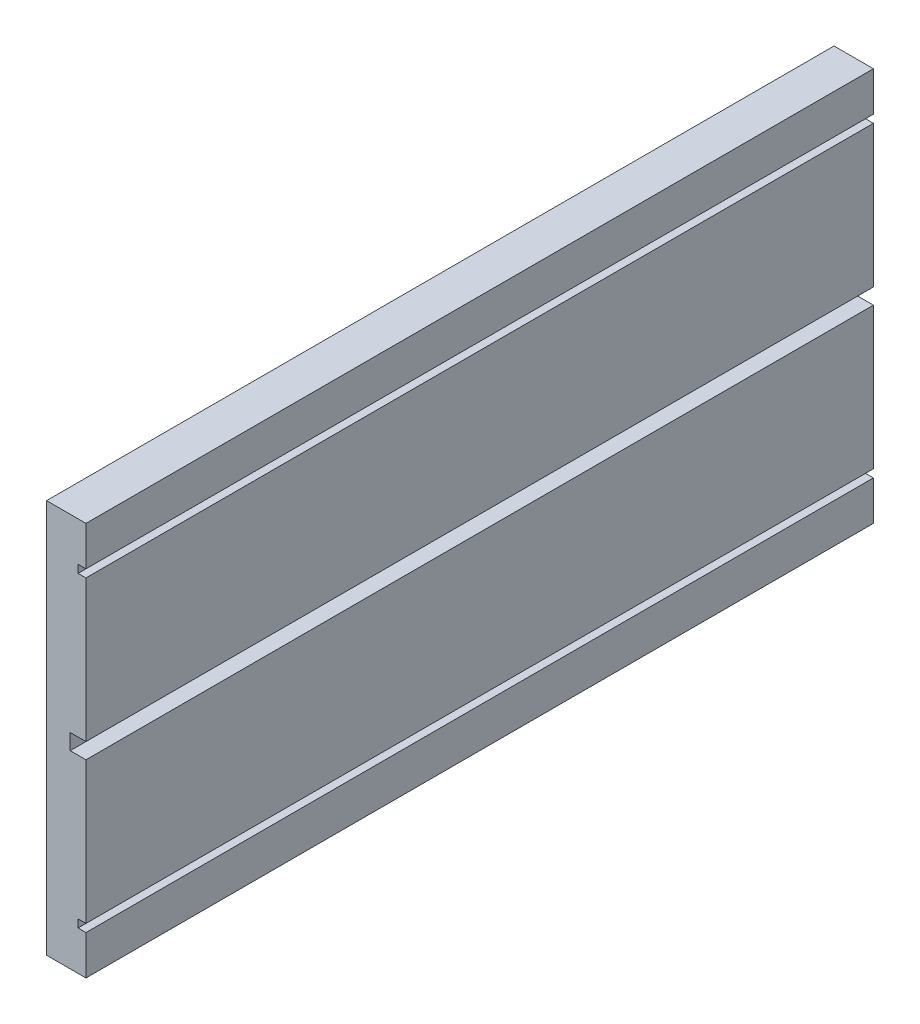
ISO-10303-21;
HEADER;
FILE_DESCRIPTION(('STEP AP214'),'2;1');
FILE_NAME('part.step','',(''),(''),'','','');
FILE_SCHEMA(('AUTOMOTIVE_DESIGN { 1 0 10303 214 1 1 1 1 }'));
ENDSEC;
DATA;
#1=APPLICATION_CONTEXT('core data for automotive mechanical design processes');
#2=APPLICATION_PROTOCOL_DEFINITION('international standard','automotive_design',2000,#1);
#3=PRODUCT_CONTEXT('',#1,'mechanical');
#4=PRODUCT('Part','Part','',(#3));
#5=PRODUCT_RELATED_PRODUCT_CATEGORY('part','',(#4));
#6=PRODUCT_DEFINITION_FORMATION('','',#4);
#7=PRODUCT_DEFINITION_CONTEXT('part definition',#1,'design');
#8=PRODUCT_DEFINITION('design','',#6,#7);
#9=PRODUCT_DEFINITION_SHAPE('','',#8);
#10=(LENGTH_UNIT() NAMED_UNIT(*) SI_UNIT(.MILLI.,.METRE.));
#11=(NAMED_UNIT(*) PLANE_ANGLE_UNIT() SI_UNIT($,.RADIAN.));
#12=(NAMED_UNIT(*) SI_UNIT($,.STERADIAN.) SOLID_ANGLE_UNIT());
#13=UNCERTAINTY_MEASURE_WITH_UNIT(LENGTH_MEASURE(1.E-05),#10,'distance_accuracy_value','');
#14=(GEOMETRIC_REPRESENTATION_CONTEXT(3) GLOBAL_UNCERTAINTY_ASSIGNED_CONTEXT((#13)) GLOBAL_UNIT_ASSIGNED_CONTEXT((#10,
#11,#12)) REPRESENTATION_CONTEXT('',''));
#15=CARTESIAN_POINT('',(0.,0.,0.));
#16=DIRECTION('',(0.,0.,1.));
#17=DIRECTION('',(1.,0.,0.));
#18=AXIS2_PLACEMENT_3D('',#15,#16,#17);
#19=CARTESIAN_POINT('',(0.025,0.25,1.));
#20=DIRECTION('',(-1.,0.,0.));
#21=DIRECTION('',(0.,-1.,0.));
#22=AXIS2_PLACEMENT_3D('',#19,#20,#21);
#23=PLANE('',#22);
#24=DIRECTION('',(0.,1.,0.));
#25=VECTOR('',#24,1.);
#26=CARTESIAN_POINT('',(0.025,0.25,1.));
#27=LINE('',#26,#25);
#28=CARTESIAN_POINT('',(0.025,0.0099999999999996,1.));
#29=VERTEX_POINT('',#28);
#30=CARTESIAN_POINT('',(0.025,0.19,1.));
#31=VERTEX_POINT('',#30);
#32=EDGE_CURVE('E230',#29,#31,#27,.T.);
#33=ORIENTED_EDGE('',*,*,#32,.F.);
#34=DIRECTION('',(0.,0.,1.));
#35=VECTOR('',#34,1.);
#36=CARTESIAN_POINT('',(0.025,0.0099999999999996,1.));
#37=LINE('',#36,#35);
#38=CARTESIAN_POINT('',(0.025,0.0099999999999996,0.));
#39=VERTEX_POINT('',#38);
#40=EDGE_CURVE('E164',#39,#29,#37,.T.);
#41=ORIENTED_EDGE('',*,*,#40,.F.);
#42=DIRECTION('',(0.,1.,0.));
#43=VECTOR('',#42,1.);
#44=CARTESIAN_POINT('',(0.025,0.25,0.));
#45=LINE('',#44,#43);
#46=CARTESIAN_POINT('',(0.025,0.19,0.));
#47=VERTEX_POINT('',#46);
#48=EDGE_CURVE('E242',#39,#47,#45,.T.);
#49=ORIENTED_EDGE('',*,*,#48,.T.);
#50=DIRECTION('',(0.,0.,-1.));
#51=VECTOR('',#50,1.);
#52=CARTESIAN_POINT('',(0.025,0.19,1.));
#53=LINE('',#52,#51);
#54=EDGE_CURVE('E187',#31,#47,#53,.T.);
#55=ORIENTED_EDGE('',*,*,#54,.F.);
#56=EDGE_LOOP('',(#33,#41,#49,#55));
#57=FACE_BOUND('',#56,.T.);
#58=ADVANCED_FACE('F36',(#57),#23,.F.);
#59=CARTESIAN_POINT('',(0.025,0.2,1.));
#60=VERTEX_POINT('',#59);
#61=CARTESIAN_POINT('',(0.025,0.25,1.));
#62=VERTEX_POINT('',#61);
#63=EDGE_CURVE('E248',#60,#62,#27,.T.);
#64=ORIENTED_EDGE('',*,*,#63,.F.);
#65=DIRECTION('',(0.,0.,1.));
#66=VECTOR('',#65,1.);
#67=CARTESIAN_POINT('',(0.025,0.2,1.));
#68=LINE('',#67,#66);
#69=CARTESIAN_POINT('',(0.025,0.2,0.));
#70=VERTEX_POINT('',#69);
#71=EDGE_CURVE('E179',#70,#60,#68,.T.);
#72=ORIENTED_EDGE('',*,*,#71,.F.);
#73=CARTESIAN_POINT('',(0.025,0.25,0.));
#74=VERTEX_POINT('',#73);
#75=EDGE_CURVE('E195',#70,#74,#45,.T.);
#76=ORIENTED_EDGE('',*,*,#75,.T.);
#77=DIRECTION('',(0.,0.,-1.));
#78=VECTOR('',#77,1.);
#79=CARTESIAN_POINT('',(0.025,0.25,1.));
#80=LINE('',#79,#78);
#81=EDGE_CURVE('E11',#62,#74,#80,.T.);
#82=ORIENTED_EDGE('',*,*,#81,.F.);
#83=EDGE_LOOP('',(#64,#72,#76,#82));
#84=FACE_BOUND('',#83,.T.);
#85=ADVANCED_FACE('F282',(#84),#23,.F.);
#86=CARTESIAN_POINT('',(0.025,-0.19,0.));
#87=VERTEX_POINT('',#86);
#88=CARTESIAN_POINT('',(0.025,-0.0100000000000002,0.));
#89=VERTEX_POINT('',#88);
#90=EDGE_CURVE('E241',#87,#89,#45,.T.);
#91=ORIENTED_EDGE('',*,*,#90,.T.);
#92=DIRECTION('',(0.,0.,-1.));
#93=VECTOR('',#92,1.);
#94=CARTESIAN_POINT('',(0.025,-0.0100000000000002,1.));
#95=LINE('',#94,#93);
#96=CARTESIAN_POINT('',(0.025,-0.0100000000000002,1.));
#97=VERTEX_POINT('',#96);
#98=EDGE_CURVE('E290',#97,#89,#95,.T.);
#99=ORIENTED_EDGE('',*,*,#98,.F.);
#100=CARTESIAN_POINT('',(0.025,-0.19,1.));
#101=VERTEX_POINT('',#100);
#102=EDGE_CURVE('E170',#101,#97,#27,.T.);
#103=ORIENTED_EDGE('',*,*,#102,.F.);
#104=DIRECTION('',(0.,0.,1.));
#105=VECTOR('',#104,1.);
#106=CARTESIAN_POINT('',(0.025,-0.19,1.));
#107=LINE('',#106,#105);
#108=EDGE_CURVE('E207',#87,#101,#107,.T.);
#109=ORIENTED_EDGE('',*,*,#108,.F.);
#110=EDGE_LOOP('',(#91,#99,#103,#109));
#111=FACE_BOUND('',#110,.T.);
#112=ADVANCED_FACE('F289',(#111),#23,.F.);
#113=CARTESIAN_POINT('',(0.025,-0.25,0.));
#114=VERTEX_POINT('',#113);
#115=CARTESIAN_POINT('',(0.025,-0.2,0.));
#116=VERTEX_POINT('',#115);
#117=EDGE_CURVE('E237',#114,#116,#45,.T.);
#118=ORIENTED_EDGE('',*,*,#117,.T.);
#119=DIRECTION('',(0.,0.,-1.));
#120=VECTOR('',#119,1.);
#121=CARTESIAN_POINT('',(0.025,-0.2,1.));
#122=LINE('',#121,#120);
#123=CARTESIAN_POINT('',(0.025,-0.2,1.));
#124=VERTEX_POINT('',#123);
#125=EDGE_CURVE('E215',#124,#116,#122,.T.);
#126=ORIENTED_EDGE('',*,*,#125,.F.);
#127=CARTESIAN_POINT('',(0.025,-0.25,1.));
#128=VERTEX_POINT('',#127);
#129=EDGE_CURVE('E226',#128,#124,#27,.T.);
#130=ORIENTED_EDGE('',*,*,#129,.F.);
#131=DIRECTION('',(0.,0.,-1.));
#132=VECTOR('',#131,1.);
#133=CARTESIAN_POINT('',(0.025,-0.25,1.));
#134=LINE('',#133,#132);
#135=EDGE_CURVE('E236',#128,#114,#134,.T.);
#136=ORIENTED_EDGE('',*,*,#135,.T.);
#137=EDGE_LOOP('',(#118,#126,#130,#136));
#138=FACE_BOUND('',#137,.T.);
#139=ADVANCED_FACE('F38',(#138),#23,.F.);
#140=CARTESIAN_POINT('',(-0.025,0.25,1.));
#141=DIRECTION('',(0.,-1.,0.));
#142=DIRECTION('',(0.,0.,-1.));
#143=AXIS2_PLACEMENT_3D('',#140,#141,#142);
#144=PLANE('',#143);
#145=DIRECTION('',(-1.,0.,0.));
#146=VECTOR('',#145,1.);
#147=CARTESIAN_POINT('',(-0.025,0.25,0.));
#148=LINE('',#147,#146);
#149=CARTESIAN_POINT('',(-0.025,0.25,0.));
#150=VERTEX_POINT('',#149);
#151=EDGE_CURVE('E240',#74,#150,#148,.T.);
#152=ORIENTED_EDGE('',*,*,#151,.T.);
#153=DIRECTION('',(0.,0.,-1.));
#154=VECTOR('',#153,1.);
#155=CARTESIAN_POINT('',(-0.025,0.25,1.));
#156=LINE('',#155,#154);
#157=CARTESIAN_POINT('',(-0.025,0.25,1.));
#158=VERTEX_POINT('',#157);
#159=EDGE_CURVE('E44',#158,#150,#156,.T.);
#160=ORIENTED_EDGE('',*,*,#159,.F.);
#161=DIRECTION('',(-1.,0.,0.));
#162=VECTOR('',#161,1.);
#163=CARTESIAN_POINT('',(-0.025,0.25,1.));
#164=LINE('',#163,#162);
#165=EDGE_CURVE('E229',#62,#158,#164,.T.);
#166=ORIENTED_EDGE('',*,*,#165,.F.);
#167=ORIENTED_EDGE('',*,*,#81,.T.);
#168=EDGE_LOOP('',(#152,#160,#166,#167));
#169=FACE_BOUND('',#168,.T.);
#170=ADVANCED_FACE('F280',(#169),#144,.F.);
#171=CARTESIAN_POINT('',(-0.025,0.25,1.));
#172=DIRECTION('',(1.,0.,0.));
#173=DIRECTION('',(0.,1.,0.));
#174=AXIS2_PLACEMENT_3D('',#171,#172,#173);
#175=PLANE('',#174);
#176=DIRECTION('',(0.,-1.,0.));
#177=VECTOR('',#176,1.);
#178=CARTESIAN_POINT('',(-0.025,0.25,0.));
#179=LINE('',#178,#177);
#180=CARTESIAN_POINT('',(-0.025,-0.25,0.));
#181=VERTEX_POINT('',#180);
#182=EDGE_CURVE('E244',#150,#181,#179,.T.);
#183=ORIENTED_EDGE('',*,*,#182,.T.);
#184=DIRECTION('',(0.,0.,-1.));
#185=VECTOR('',#184,1.);
#186=CARTESIAN_POINT('',(-0.025,-0.25,1.));
#187=LINE('',#186,#185);
#188=CARTESIAN_POINT('',(-0.025,-0.25,1.));
#189=VERTEX_POINT('',#188);
#190=EDGE_CURVE('E251',#189,#181,#187,.T.);
#191=ORIENTED_EDGE('',*,*,#190,.F.);
#192=DIRECTION('',(0.,-1.,0.));
#193=VECTOR('',#192,1.);
#194=CARTESIAN_POINT('',(-0.025,0.25,1.));
#195=LINE('',#194,#193);
#196=EDGE_CURVE('E232',#158,#189,#195,.T.);
#197=ORIENTED_EDGE('',*,*,#196,.F.);
#198=ORIENTED_EDGE('',*,*,#159,.T.);
#199=EDGE_LOOP('',(#183,#191,#197,#198));
#200=FACE_BOUND('',#199,.T.);
#201=ADVANCED_FACE('F258',(#200),#175,.F.);
#202=CARTESIAN_POINT('',(-0.025,-0.25,1.));
#203=DIRECTION('',(0.,1.,0.));
#204=DIRECTION('',(0.,0.,1.));
#205=AXIS2_PLACEMENT_3D('',#202,#203,#204);
#206=PLANE('',#205);
#207=DIRECTION('',(1.,0.,0.));
#208=VECTOR('',#207,1.);
#209=CARTESIAN_POINT('',(-0.025,-0.25,0.));
#210=LINE('',#209,#208);
#211=EDGE_CURVE('E246',#181,#114,#210,.T.);
#212=ORIENTED_EDGE('',*,*,#211,.T.);
#213=ORIENTED_EDGE('',*,*,#135,.F.);
#214=DIRECTION('',(1.,0.,0.));
#215=VECTOR('',#214,1.);
#216=CARTESIAN_POINT('',(-0.025,-0.25,1.));
#217=LINE('',#216,#215);
#218=EDGE_CURVE('E234',#189,#128,#217,.T.);
#219=ORIENTED_EDGE('',*,*,#218,.F.);
#220=ORIENTED_EDGE('',*,*,#190,.T.);
#221=EDGE_LOOP('',(#212,#213,#219,#220));
#222=FACE_BOUND('',#221,.T.);
#223=ADVANCED_FACE('F271',(#222),#206,.F.);
#224=CARTESIAN_POINT('',(0.,0.,1.));
#225=DIRECTION('',(0.,0.,1.));
#226=DIRECTION('',(1.,0.,0.));
#227=AXIS2_PLACEMENT_3D('',#224,#225,#226);
#228=PLANE('',#227);
#229=DIRECTION('',(1.,0.,0.));
#230=VECTOR('',#229,1.);
#231=CARTESIAN_POINT('',(0.00500000000000001,0.00999999999999959,1.));
#232=LINE('',#231,#230);
#233=CARTESIAN_POINT('',(0.00500000000000001,0.00999999999999959,1.));
#234=VERTEX_POINT('',#233);
#235=EDGE_CURVE('E217',#234,#29,#232,.T.);
#236=ORIENTED_EDGE('',*,*,#235,.T.);
#237=ORIENTED_EDGE('',*,*,#32,.T.);
#238=DIRECTION('',(1.,0.,0.));
#239=VECTOR('',#238,1.);
#240=CARTESIAN_POINT('',(0.015,0.19,1.));
#241=LINE('',#240,#239);
#242=CARTESIAN_POINT('',(0.015,0.19,1.));
#243=VERTEX_POINT('',#242);
#244=EDGE_CURVE('E186',#243,#31,#241,.T.);
#245=ORIENTED_EDGE('',*,*,#244,.F.);
#246=DIRECTION('',(0.,-1.,0.));
#247=VECTOR('',#246,1.);
#248=CARTESIAN_POINT('',(0.015,0.2,1.));
#249=LINE('',#248,#247);
#250=CARTESIAN_POINT('',(0.015,0.2,1.));
#251=VERTEX_POINT('',#250);
#252=EDGE_CURVE('E177',#251,#243,#249,.T.);
#253=ORIENTED_EDGE('',*,*,#252,.F.);
#254=DIRECTION('',(1.,0.,0.));
#255=VECTOR('',#254,1.);
#256=CARTESIAN_POINT('',(0.015,0.2,1.));
#257=LINE('',#256,#255);
#258=EDGE_CURVE('E192',#251,#60,#257,.T.);
#259=ORIENTED_EDGE('',*,*,#258,.T.);
#260=ORIENTED_EDGE('',*,*,#63,.T.);
#261=ORIENTED_EDGE('',*,*,#165,.T.);
#262=ORIENTED_EDGE('',*,*,#196,.T.);
#263=ORIENTED_EDGE('',*,*,#218,.T.);
#264=ORIENTED_EDGE('',*,*,#129,.T.);
#265=DIRECTION('',(1.,0.,0.));
#266=VECTOR('',#265,1.);
#267=CARTESIAN_POINT('',(0.015,-0.2,1.));
#268=LINE('',#267,#266);
#269=CARTESIAN_POINT('',(0.015,-0.2,1.));
#270=VERTEX_POINT('',#269);
#271=EDGE_CURVE('E214',#270,#124,#268,.T.);
#272=ORIENTED_EDGE('',*,*,#271,.F.);
#273=DIRECTION('',(0.,-1.,0.));
#274=VECTOR('',#273,1.);
#275=CARTESIAN_POINT('',(0.015,-0.19,1.));
#276=LINE('',#275,#274);
#277=CARTESIAN_POINT('',(0.015,-0.19,1.));
#278=VERTEX_POINT('',#277);
#279=EDGE_CURVE('E203',#278,#270,#276,.T.);
#280=ORIENTED_EDGE('',*,*,#279,.F.);
#281=DIRECTION('',(1.,0.,0.));
#282=VECTOR('',#281,1.);
#283=CARTESIAN_POINT('',(0.015,-0.19,1.));
#284=LINE('',#283,#282);
#285=EDGE_CURVE('E190',#278,#101,#284,.T.);
#286=ORIENTED_EDGE('',*,*,#285,.T.);
#287=ORIENTED_EDGE('',*,*,#102,.T.);
#288=DIRECTION('',(1.,0.,0.));
#289=VECTOR('',#288,1.);
#290=CARTESIAN_POINT('',(0.00500000000000001,-0.0100000000000002,1.));
#291=LINE('',#290,#289);
#292=CARTESIAN_POINT('',(0.00500000000000001,-0.0100000000000002,1.));
#293=VERTEX_POINT('',#292);
#294=EDGE_CURVE('E149',#293,#97,#291,.T.);
#295=ORIENTED_EDGE('',*,*,#294,.F.);
#296=DIRECTION('',(0.,-1.,0.));
#297=VECTOR('',#296,1.);
#298=CARTESIAN_POINT('',(0.00500000000000001,0.00999999999999959,1.));
#299=LINE('',#298,#297);
#300=EDGE_CURVE('E155',#234,#293,#299,.T.);
#301=ORIENTED_EDGE('',*,*,#300,.F.);
#302=EDGE_LOOP('',(#236,#237,#245,#253,#259,#260,#261,#262,#263,#264,#272,#280,#286,#287,#295,#301));
#303=FACE_BOUND('',#302,.T.);
#304=ADVANCED_FACE('F167',(#303),#228,.T.);
#305=CARTESIAN_POINT('',(0.,0.,0.));
#306=DIRECTION('',(0.,0.,1.));
#307=DIRECTION('',(1.,0.,0.));
#308=AXIS2_PLACEMENT_3D('',#305,#306,#307);
#309=PLANE('',#308);
#310=ORIENTED_EDGE('',*,*,#48,.F.);
#311=DIRECTION('',(1.,0.,0.));
#312=VECTOR('',#311,1.);
#313=CARTESIAN_POINT('',(0.00500000000000001,0.00999999999999959,0.));
#314=LINE('',#313,#312);
#315=CARTESIAN_POINT('',(0.00500000000000001,0.00999999999999959,0.));
#316=VERTEX_POINT('',#315);
#317=EDGE_CURVE('E172',#316,#39,#314,.T.);
#318=ORIENTED_EDGE('',*,*,#317,.F.);
#319=DIRECTION('',(0.,1.,0.));
#320=VECTOR('',#319,1.);
#321=CARTESIAN_POINT('',(0.00500000000000001,0.00999999999999959,0.));
#322=LINE('',#321,#320);
#323=CARTESIAN_POINT('',(0.00500000000000001,-0.0100000000000002,0.));
#324=VERTEX_POINT('',#323);
#325=EDGE_CURVE('E154',#324,#316,#322,.T.);
#326=ORIENTED_EDGE('',*,*,#325,.F.);
#327=DIRECTION('',(1.,0.,0.));
#328=VECTOR('',#327,1.);
#329=CARTESIAN_POINT('',(0.00500000000000001,-0.0100000000000002,0.));
#330=LINE('',#329,#328);
#331=EDGE_CURVE('E152',#324,#89,#330,.T.);
#332=ORIENTED_EDGE('',*,*,#331,.T.);
#333=ORIENTED_EDGE('',*,*,#90,.F.);
#334=DIRECTION('',(1.,0.,0.));
#335=VECTOR('',#334,1.);
#336=CARTESIAN_POINT('',(0.015,-0.19,0.));
#337=LINE('',#336,#335);
#338=CARTESIAN_POINT('',(0.015,-0.19,0.));
#339=VERTEX_POINT('',#338);
#340=EDGE_CURVE('E220',#339,#87,#337,.T.);
#341=ORIENTED_EDGE('',*,*,#340,.F.);
#342=DIRECTION('',(0.,1.,0.));
#343=VECTOR('',#342,1.);
#344=CARTESIAN_POINT('',(0.015,-0.19,0.));
#345=LINE('',#344,#343);
#346=CARTESIAN_POINT('',(0.015,-0.2,0.));
#347=VERTEX_POINT('',#346);
#348=EDGE_CURVE('E209',#347,#339,#345,.T.);
#349=ORIENTED_EDGE('',*,*,#348,.F.);
#350=DIRECTION('',(1.,0.,0.));
#351=VECTOR('',#350,1.);
#352=CARTESIAN_POINT('',(0.015,-0.2,0.));
#353=LINE('',#352,#351);
#354=EDGE_CURVE('E222',#347,#116,#353,.T.);
#355=ORIENTED_EDGE('',*,*,#354,.T.);
#356=ORIENTED_EDGE('',*,*,#117,.F.);
#357=ORIENTED_EDGE('',*,*,#211,.F.);
#358=ORIENTED_EDGE('',*,*,#182,.F.);
#359=ORIENTED_EDGE('',*,*,#151,.F.);
#360=ORIENTED_EDGE('',*,*,#75,.F.);
#361=DIRECTION('',(1.,0.,0.));
#362=VECTOR('',#361,1.);
#363=CARTESIAN_POINT('',(0.015,0.2,0.));
#364=LINE('',#363,#362);
#365=CARTESIAN_POINT('',(0.015,0.2,0.));
#366=VERTEX_POINT('',#365);
#367=EDGE_CURVE('E196',#366,#70,#364,.T.);
#368=ORIENTED_EDGE('',*,*,#367,.F.);
#369=DIRECTION('',(0.,1.,0.));
#370=VECTOR('',#369,1.);
#371=CARTESIAN_POINT('',(0.015,0.2,0.));
#372=LINE('',#371,#370);
#373=CARTESIAN_POINT('',(0.015,0.19,0.));
#374=VERTEX_POINT('',#373);
#375=EDGE_CURVE('E181',#374,#366,#372,.T.);
#376=ORIENTED_EDGE('',*,*,#375,.F.);
#377=DIRECTION('',(1.,0.,0.));
#378=VECTOR('',#377,1.);
#379=CARTESIAN_POINT('',(0.015,0.19,0.));
#380=LINE('',#379,#378);
#381=EDGE_CURVE('E198',#374,#47,#380,.T.);
#382=ORIENTED_EDGE('',*,*,#381,.T.);
#383=EDGE_LOOP('',(#310,#318,#326,#332,#333,#341,#349,#355,#356,#357,#358,#359,#360,#368,#376,#382));
#384=FACE_BOUND('',#383,.T.);
#385=ADVANCED_FACE('F266',(#384),#309,.F.);
#386=CARTESIAN_POINT('',(0.015,-0.19,1.));
#387=DIRECTION('',(0.,1.,0.));
#388=DIRECTION('',(-1.,0.,0.));
#389=AXIS2_PLACEMENT_3D('',#386,#387,#388);
#390=PLANE('',#389);
#391=ORIENTED_EDGE('',*,*,#108,.T.);
#392=ORIENTED_EDGE('',*,*,#285,.F.);
#393=DIRECTION('',(0.,0.,1.));
#394=VECTOR('',#393,1.);
#395=CARTESIAN_POINT('',(0.015,-0.19,1.));
#396=LINE('',#395,#394);
#397=EDGE_CURVE('E211',#339,#278,#396,.T.);
#398=ORIENTED_EDGE('',*,*,#397,.F.);
#399=ORIENTED_EDGE('',*,*,#340,.T.);
#400=EDGE_LOOP('',(#391,#392,#398,#399));
#401=FACE_BOUND('',#400,.T.);
#402=ADVANCED_FACE('F357',(#401),#390,.F.);
#403=CARTESIAN_POINT('',(0.015,-0.2,1.));
#404=DIRECTION('',(0.,-1.,0.));
#405=DIRECTION('',(1.,0.,0.));
#406=AXIS2_PLACEMENT_3D('',#403,#404,#405);
#407=PLANE('',#406);
#408=ORIENTED_EDGE('',*,*,#125,.T.);
#409=ORIENTED_EDGE('',*,*,#354,.F.);
#410=DIRECTION('',(0.,0.,-1.));
#411=VECTOR('',#410,1.);
#412=CARTESIAN_POINT('',(0.015,-0.2,1.));
#413=LINE('',#412,#411);
#414=EDGE_CURVE('E206',#270,#347,#413,.T.);
#415=ORIENTED_EDGE('',*,*,#414,.F.);
#416=ORIENTED_EDGE('',*,*,#271,.T.);
#417=EDGE_LOOP('',(#408,#409,#415,#416));
#418=FACE_BOUND('',#417,.T.);
#419=ADVANCED_FACE('F321',(#418),#407,.F.);
#420=CARTESIAN_POINT('',(0.015,0.,0.));
#421=DIRECTION('',(1.,0.,0.));
#422=DIRECTION('',(0.,0.,-1.));
#423=AXIS2_PLACEMENT_3D('',#420,#421,#422);
#424=PLANE('',#423);
#425=ORIENTED_EDGE('',*,*,#279,.T.);
#426=ORIENTED_EDGE('',*,*,#414,.T.);
#427=ORIENTED_EDGE('',*,*,#348,.T.);
#428=ORIENTED_EDGE('',*,*,#397,.T.);
#429=EDGE_LOOP('',(#425,#426,#427,#428));
#430=FACE_BOUND('',#429,.T.);
#431=ADVANCED_FACE('F314',(#430),#424,.T.);
#432=CARTESIAN_POINT('',(0.015,0.2,1.));
#433=DIRECTION('',(0.,1.,0.));
#434=DIRECTION('',(-1.,0.,0.));
#435=AXIS2_PLACEMENT_3D('',#432,#433,#434);
#436=PLANE('',#435);
#437=ORIENTED_EDGE('',*,*,#71,.T.);
#438=ORIENTED_EDGE('',*,*,#258,.F.);
#439=DIRECTION('',(0.,0.,1.));
#440=VECTOR('',#439,1.);
#441=CARTESIAN_POINT('',(0.015,0.2,1.));
#442=LINE('',#441,#440);
#443=EDGE_CURVE('E183',#366,#251,#442,.T.);
#444=ORIENTED_EDGE('',*,*,#443,.F.);
#445=ORIENTED_EDGE('',*,*,#367,.T.);
#446=EDGE_LOOP('',(#437,#438,#444,#445));
#447=FACE_BOUND('',#446,.T.);
#448=ADVANCED_FACE('F312',(#447),#436,.F.);
#449=CARTESIAN_POINT('',(0.015,0.19,1.));
#450=DIRECTION('',(0.,-1.,0.));
#451=DIRECTION('',(1.,0.,0.));
#452=AXIS2_PLACEMENT_3D('',#449,#450,#451);
#453=PLANE('',#452);
#454=ORIENTED_EDGE('',*,*,#54,.T.);
#455=ORIENTED_EDGE('',*,*,#381,.F.);
#456=DIRECTION('',(0.,0.,-1.));
#457=VECTOR('',#456,1.);
#458=CARTESIAN_POINT('',(0.015,0.19,1.));
#459=LINE('',#458,#457);
#460=EDGE_CURVE('E59',#243,#374,#459,.T.);
#461=ORIENTED_EDGE('',*,*,#460,.F.);
#462=ORIENTED_EDGE('',*,*,#244,.T.);
#463=EDGE_LOOP('',(#454,#455,#461,#462));
#464=FACE_BOUND('',#463,.T.);
#465=ADVANCED_FACE('F306',(#464),#453,.F.);
#466=CARTESIAN_POINT('',(0.015,0.,0.));
#467=DIRECTION('',(1.,0.,0.));
#468=DIRECTION('',(0.,0.,-1.));
#469=AXIS2_PLACEMENT_3D('',#466,#467,#468);
#470=PLANE('',#469);
#471=ORIENTED_EDGE('',*,*,#252,.T.);
#472=ORIENTED_EDGE('',*,*,#460,.T.);
#473=ORIENTED_EDGE('',*,*,#375,.T.);
#474=ORIENTED_EDGE('',*,*,#443,.T.);
#475=EDGE_LOOP('',(#471,#472,#473,#474));
#476=FACE_BOUND('',#475,.T.);
#477=ADVANCED_FACE('F309',(#476),#470,.T.);
#478=CARTESIAN_POINT('',(0.00500000000000001,0.00999999999999959,1.));
#479=DIRECTION('',(0.,1.,0.));
#480=DIRECTION('',(-1.,0.,0.));
#481=AXIS2_PLACEMENT_3D('',#478,#479,#480);
#482=PLANE('',#481);
#483=ORIENTED_EDGE('',*,*,#40,.T.);
#484=ORIENTED_EDGE('',*,*,#235,.F.);
#485=DIRECTION('',(0.,0.,1.));
#486=VECTOR('',#485,1.);
#487=CARTESIAN_POINT('',(0.00500000000000001,0.00999999999999959,1.));
#488=LINE('',#487,#486);
#489=EDGE_CURVE('E161',#316,#234,#488,.T.);
#490=ORIENTED_EDGE('',*,*,#489,.F.);
#491=ORIENTED_EDGE('',*,*,#317,.T.);
#492=EDGE_LOOP('',(#483,#484,#490,#491));
#493=FACE_BOUND('',#492,.T.);
#494=ADVANCED_FACE('F300',(#493),#482,.F.);
#495=CARTESIAN_POINT('',(0.00500000000000001,-0.0100000000000002,1.));
#496=DIRECTION('',(0.,-1.,0.));
#497=DIRECTION('',(1.,0.,0.));
#498=AXIS2_PLACEMENT_3D('',#495,#496,#497);
#499=PLANE('',#498);
#500=ORIENTED_EDGE('',*,*,#98,.T.);
#501=ORIENTED_EDGE('',*,*,#331,.F.);
#502=DIRECTION('',(0.,0.,-1.));
#503=VECTOR('',#502,1.);
#504=CARTESIAN_POINT('',(0.00500000000000001,-0.0100000000000002,1.));
#505=LINE('',#504,#503);
#506=EDGE_CURVE('E51',#293,#324,#505,.T.);
#507=ORIENTED_EDGE('',*,*,#506,.F.);
#508=ORIENTED_EDGE('',*,*,#294,.T.);
#509=EDGE_LOOP('',(#500,#501,#507,#508));
#510=FACE_BOUND('',#509,.T.);
#511=ADVANCED_FACE('F147',(#510),#499,.F.);
#512=CARTESIAN_POINT('',(0.00500000000000001,0.,0.));
#513=DIRECTION('',(1.,0.,0.));
#514=DIRECTION('',(0.,0.,-1.));
#515=AXIS2_PLACEMENT_3D('',#512,#513,#514);
#516=PLANE('',#515);
#517=ORIENTED_EDGE('',*,*,#300,.T.);
#518=ORIENTED_EDGE('',*,*,#506,.T.);
#519=ORIENTED_EDGE('',*,*,#325,.T.);
#520=ORIENTED_EDGE('',*,*,#489,.T.);
#521=EDGE_LOOP('',(#517,#518,#519,#520));
#522=FACE_BOUND('',#521,.T.);
#523=ADVANCED_FACE('F159',(#522),#516,.T.);
#524=CLOSED_SHELL('',(#58,#85,#112,#139,#170,#201,#223,#304,#385,#402,#419,#431,#448,#465,#477,
#494,#511,#523));
#525=MANIFOLD_SOLID_BREP('B2',#524);
#526=ADVANCED_BREP_SHAPE_REPRESENTATION('',(#18,#525),#14);
#527=SHAPE_DEFINITION_REPRESENTATION(#9,#526);
ENDSEC;
END-ISO-10303-21;
